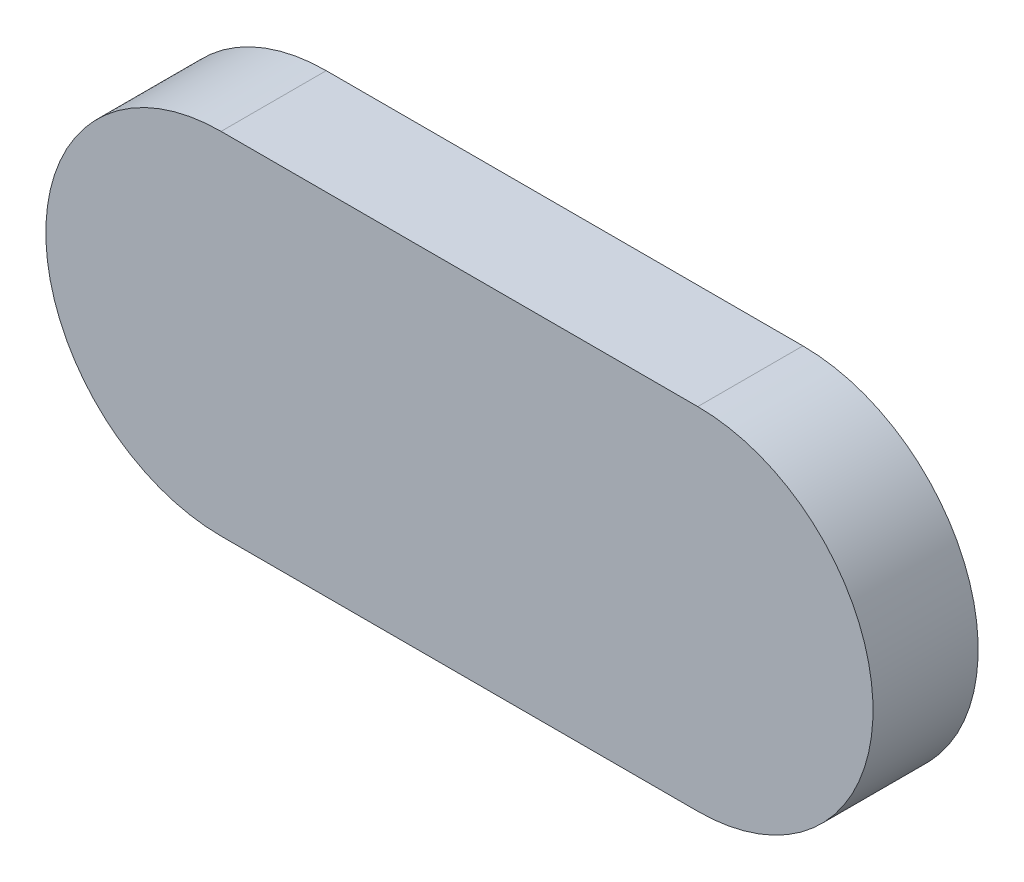
ISO-10303-21;
HEADER;
FILE_DESCRIPTION(('STEP AP214'),'2;1');
FILE_NAME('part.step','',(''),(''),'','','');
FILE_SCHEMA(('AUTOMOTIVE_DESIGN { 1 0 10303 214 1 1 1 1 }'));
ENDSEC;
DATA;
#1=APPLICATION_CONTEXT('core data for automotive mechanical design processes');
#2=APPLICATION_PROTOCOL_DEFINITION('international standard','automotive_design',2000,#1);
#3=PRODUCT_CONTEXT('',#1,'mechanical');
#4=PRODUCT('Part','Part','',(#3));
#5=PRODUCT_RELATED_PRODUCT_CATEGORY('part','',(#4));
#6=PRODUCT_DEFINITION_FORMATION('','',#4);
#7=PRODUCT_DEFINITION_CONTEXT('part definition',#1,'design');
#8=PRODUCT_DEFINITION('design','',#6,#7);
#9=PRODUCT_DEFINITION_SHAPE('','',#8);
#10=(LENGTH_UNIT() NAMED_UNIT(*) SI_UNIT(.MILLI.,.METRE.));
#11=(NAMED_UNIT(*) PLANE_ANGLE_UNIT() SI_UNIT($,.RADIAN.));
#12=(NAMED_UNIT(*) SI_UNIT($,.STERADIAN.) SOLID_ANGLE_UNIT());
#13=UNCERTAINTY_MEASURE_WITH_UNIT(LENGTH_MEASURE(1.E-05),#10,'distance_accuracy_value','');
#14=(GEOMETRIC_REPRESENTATION_CONTEXT(3) GLOBAL_UNCERTAINTY_ASSIGNED_CONTEXT((#13)) GLOBAL_UNIT_ASSIGNED_CONTEXT((#10,
#11,#12)) REPRESENTATION_CONTEXT('',''));
#15=CARTESIAN_POINT('',(0.,0.,0.));
#16=DIRECTION('',(0.,0.,1.));
#17=DIRECTION('',(1.,0.,0.));
#18=AXIS2_PLACEMENT_3D('',#15,#16,#17);
#19=CARTESIAN_POINT('',(0.,-25.,15.));
#20=DIRECTION('',(0.,1.,0.));
#21=DIRECTION('',(-1.,0.,0.));
#22=AXIS2_PLACEMENT_3D('',#19,#20,#21);
#23=PLANE('',#22);
#24=DIRECTION('',(1.,0.,0.));
#25=VECTOR('',#24,1.);
#26=CARTESIAN_POINT('',(0.,-25.,0.));
#27=LINE('',#26,#25);
#28=CARTESIAN_POINT('',(-34.,-25.,0.));
#29=VERTEX_POINT('',#28);
#30=CARTESIAN_POINT('',(34.,-25.,0.));
#31=VERTEX_POINT('',#30);
#32=EDGE_CURVE('E105',#29,#31,#27,.T.);
#33=ORIENTED_EDGE('',*,*,#32,.T.);
#34=DIRECTION('',(0.,0.,-1.));
#35=VECTOR('',#34,1.);
#36=CARTESIAN_POINT('',(34.,-25.,15.));
#37=LINE('',#36,#35);
#38=CARTESIAN_POINT('',(34.,-25.,15.));
#39=VERTEX_POINT('',#38);
#40=EDGE_CURVE('E11',#39,#31,#37,.T.);
#41=ORIENTED_EDGE('',*,*,#40,.F.);
#42=DIRECTION('',(1.,0.,0.));
#43=VECTOR('',#42,1.);
#44=CARTESIAN_POINT('',(0.,-25.,15.));
#45=LINE('',#44,#43);
#46=CARTESIAN_POINT('',(-34.,-25.,15.));
#47=VERTEX_POINT('',#46);
#48=EDGE_CURVE('E82',#47,#39,#45,.T.);
#49=ORIENTED_EDGE('',*,*,#48,.F.);
#50=DIRECTION('',(0.,0.,-1.));
#51=VECTOR('',#50,1.);
#52=CARTESIAN_POINT('',(-34.,-25.,15.));
#53=LINE('',#52,#51);
#54=EDGE_CURVE('E58',#47,#29,#53,.T.);
#55=ORIENTED_EDGE('',*,*,#54,.T.);
#56=EDGE_LOOP('',(#33,#41,#49,#55));
#57=FACE_BOUND('',#56,.T.);
#58=ADVANCED_FACE('F42',(#57),#23,.F.);
#59=CARTESIAN_POINT('',(34.,0.,15.));
#60=DIRECTION('',(0.,0.,-1.));
#61=DIRECTION('',(-1.,0.,0.));
#62=AXIS2_PLACEMENT_3D('',#59,#60,#61);
#63=CYLINDRICAL_SURFACE('',#62,25.);
#64=CARTESIAN_POINT('',(34.,0.,0.));
#65=DIRECTION('',(0.,0.,1.));
#66=DIRECTION('',(1.,0.,0.));
#67=AXIS2_PLACEMENT_3D('',#64,#65,#66);
#68=CIRCLE('',#67,25.);
#69=CARTESIAN_POINT('',(34.,25.,0.));
#70=VERTEX_POINT('',#69);
#71=EDGE_CURVE('E91',#70,#31,#68,.F.);
#72=ORIENTED_EDGE('',*,*,#71,.F.);
#73=DIRECTION('',(0.,0.,-1.));
#74=VECTOR('',#73,1.);
#75=CARTESIAN_POINT('',(34.,25.,15.));
#76=LINE('',#75,#74);
#77=CARTESIAN_POINT('',(34.,25.,15.));
#78=VERTEX_POINT('',#77);
#79=EDGE_CURVE('E50',#78,#70,#76,.T.);
#80=ORIENTED_EDGE('',*,*,#79,.F.);
#81=CARTESIAN_POINT('',(34.,0.,15.));
#82=DIRECTION('',(0.,0.,1.));
#83=DIRECTION('',(1.,0.,0.));
#84=AXIS2_PLACEMENT_3D('',#81,#82,#83);
#85=CIRCLE('',#84,25.);
#86=EDGE_CURVE('E89',#78,#39,#85,.F.);
#87=ORIENTED_EDGE('',*,*,#86,.T.);
#88=ORIENTED_EDGE('',*,*,#40,.T.);
#89=EDGE_LOOP('',(#72,#80,#87,#88));
#90=FACE_BOUND('',#89,.T.);
#91=ADVANCED_FACE('F88',(#90),#63,.T.);
#92=CARTESIAN_POINT('',(0.,25.,15.));
#93=DIRECTION('',(0.,1.,0.));
#94=DIRECTION('',(-1.,0.,0.));
#95=AXIS2_PLACEMENT_3D('',#92,#93,#94);
#96=PLANE('',#95);
#97=DIRECTION('',(1.,0.,0.));
#98=VECTOR('',#97,1.);
#99=CARTESIAN_POINT('',(0.,25.,0.));
#100=LINE('',#99,#98);
#101=CARTESIAN_POINT('',(-34.,25.,0.));
#102=VERTEX_POINT('',#101);
#103=EDGE_CURVE('E108',#102,#70,#100,.T.);
#104=ORIENTED_EDGE('',*,*,#103,.F.);
#105=DIRECTION('',(0.,0.,-1.));
#106=VECTOR('',#105,1.);
#107=CARTESIAN_POINT('',(-34.,25.,15.));
#108=LINE('',#107,#106);
#109=CARTESIAN_POINT('',(-34.,25.,15.));
#110=VERTEX_POINT('',#109);
#111=EDGE_CURVE('E71',#110,#102,#108,.T.);
#112=ORIENTED_EDGE('',*,*,#111,.F.);
#113=DIRECTION('',(1.,0.,0.));
#114=VECTOR('',#113,1.);
#115=CARTESIAN_POINT('',(0.,25.,15.));
#116=LINE('',#115,#114);
#117=EDGE_CURVE('E97',#110,#78,#116,.T.);
#118=ORIENTED_EDGE('',*,*,#117,.T.);
#119=ORIENTED_EDGE('',*,*,#79,.T.);
#120=EDGE_LOOP('',(#104,#112,#118,#119));
#121=FACE_BOUND('',#120,.T.);
#122=ADVANCED_FACE('F99',(#121),#96,.T.);
#123=CARTESIAN_POINT('',(-34.,0.,15.));
#124=DIRECTION('',(0.,0.,-1.));
#125=DIRECTION('',(-1.,0.,0.));
#126=AXIS2_PLACEMENT_3D('',#123,#124,#125);
#127=CYLINDRICAL_SURFACE('',#126,25.);
#128=CARTESIAN_POINT('',(-34.,0.,0.));
#129=DIRECTION('',(0.,0.,1.));
#130=DIRECTION('',(1.,0.,0.));
#131=AXIS2_PLACEMENT_3D('',#128,#129,#130);
#132=CIRCLE('',#131,25.);
#133=EDGE_CURVE('E110',#29,#102,#132,.F.);
#134=ORIENTED_EDGE('',*,*,#133,.F.);
#135=ORIENTED_EDGE('',*,*,#54,.F.);
#136=CARTESIAN_POINT('',(-34.,0.,15.));
#137=DIRECTION('',(0.,0.,1.));
#138=DIRECTION('',(1.,0.,0.));
#139=AXIS2_PLACEMENT_3D('',#136,#137,#138);
#140=CIRCLE('',#139,25.);
#141=EDGE_CURVE('E100',#47,#110,#140,.F.);
#142=ORIENTED_EDGE('',*,*,#141,.T.);
#143=ORIENTED_EDGE('',*,*,#111,.T.);
#144=EDGE_LOOP('',(#134,#135,#142,#143));
#145=FACE_BOUND('',#144,.T.);
#146=ADVANCED_FACE('F116',(#145),#127,.T.);
#147=CARTESIAN_POINT('',(0.,0.,15.));
#148=DIRECTION('',(0.,0.,1.));
#149=DIRECTION('',(1.,0.,0.));
#150=AXIS2_PLACEMENT_3D('',#147,#148,#149);
#151=PLANE('',#150);
#152=ORIENTED_EDGE('',*,*,#48,.T.);
#153=ORIENTED_EDGE('',*,*,#86,.F.);
#154=ORIENTED_EDGE('',*,*,#117,.F.);
#155=ORIENTED_EDGE('',*,*,#141,.F.);
#156=EDGE_LOOP('',(#152,#153,#154,#155));
#157=FACE_BOUND('',#156,.T.);
#158=ADVANCED_FACE('F96',(#157),#151,.T.);
#159=CARTESIAN_POINT('',(0.,0.,0.));
#160=DIRECTION('',(0.,0.,1.));
#161=DIRECTION('',(1.,0.,0.));
#162=AXIS2_PLACEMENT_3D('',#159,#160,#161);
#163=PLANE('',#162);
#164=ORIENTED_EDGE('',*,*,#32,.F.);
#165=ORIENTED_EDGE('',*,*,#133,.T.);
#166=ORIENTED_EDGE('',*,*,#103,.T.);
#167=ORIENTED_EDGE('',*,*,#71,.T.);
#168=EDGE_LOOP('',(#164,#165,#166,#167));
#169=FACE_BOUND('',#168,.T.);
#170=ADVANCED_FACE('F115',(#169),#163,.F.);
#171=CLOSED_SHELL('',(#58,#91,#122,#146,#158,#170));
#172=MANIFOLD_SOLID_BREP('B2',#171);
#173=ADVANCED_BREP_SHAPE_REPRESENTATION('',(#18,#172),#14);
#174=SHAPE_DEFINITION_REPRESENTATION(#9,#173);
ENDSEC;
END-ISO-10303-21;
